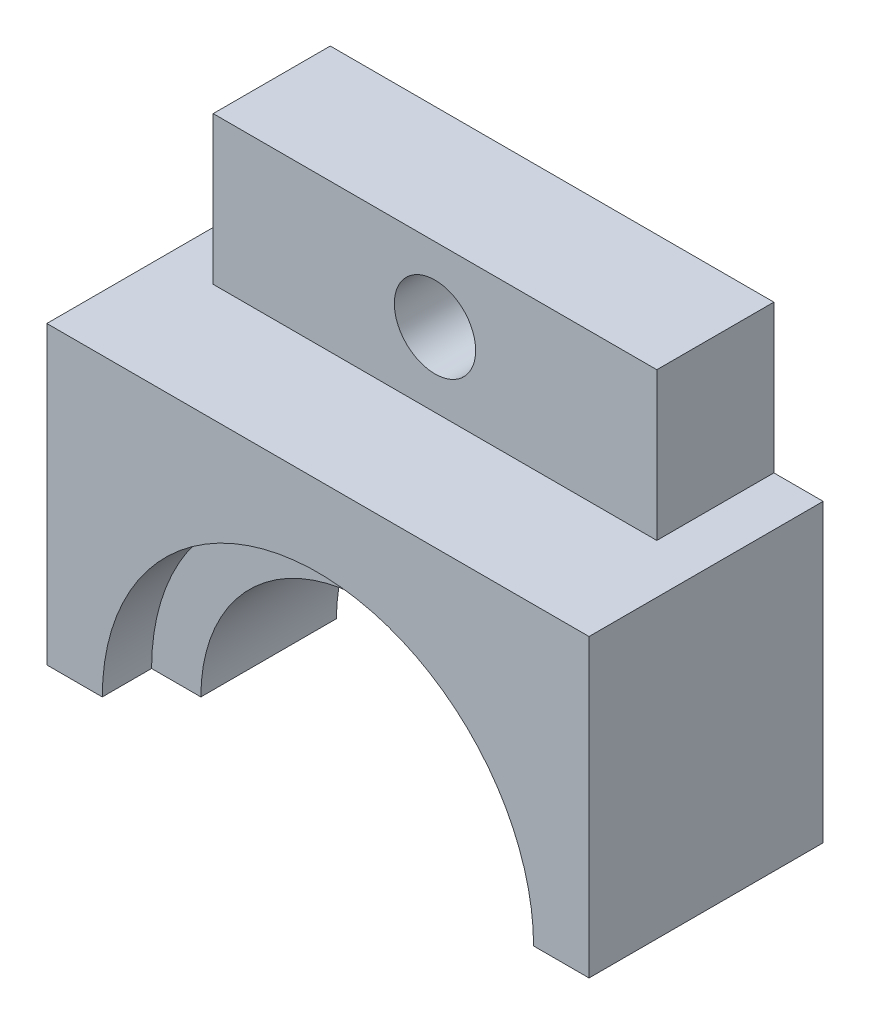
ISO-10303-21;
HEADER;
FILE_DESCRIPTION(('STEP AP214'),'2;1');
FILE_NAME('part.step','',(''),(''),'','','');
FILE_SCHEMA(('AUTOMOTIVE_DESIGN { 1 0 10303 214 1 1 1 1 }'));
ENDSEC;
DATA;
#1=APPLICATION_CONTEXT('core data for automotive mechanical design processes');
#2=APPLICATION_PROTOCOL_DEFINITION('international standard','automotive_design',2000,#1);
#3=PRODUCT_CONTEXT('',#1,'mechanical');
#4=PRODUCT('Part','Part','',(#3));
#5=PRODUCT_RELATED_PRODUCT_CATEGORY('part','',(#4));
#6=PRODUCT_DEFINITION_FORMATION('','',#4);
#7=PRODUCT_DEFINITION_CONTEXT('part definition',#1,'design');
#8=PRODUCT_DEFINITION('design','',#6,#7);
#9=PRODUCT_DEFINITION_SHAPE('','',#8);
#10=(LENGTH_UNIT() NAMED_UNIT(*) SI_UNIT(.MILLI.,.METRE.));
#11=(NAMED_UNIT(*) PLANE_ANGLE_UNIT() SI_UNIT($,.RADIAN.));
#12=(NAMED_UNIT(*) SI_UNIT($,.STERADIAN.) SOLID_ANGLE_UNIT());
#13=UNCERTAINTY_MEASURE_WITH_UNIT(LENGTH_MEASURE(1.E-05),#10,'distance_accuracy_value','');
#14=(GEOMETRIC_REPRESENTATION_CONTEXT(3) GLOBAL_UNCERTAINTY_ASSIGNED_CONTEXT((#13)) GLOBAL_UNIT_ASSIGNED_CONTEXT((#10,
#11,#12)) REPRESENTATION_CONTEXT('',''));
#15=CARTESIAN_POINT('',(0.,0.,0.));
#16=DIRECTION('',(0.,0.,1.));
#17=DIRECTION('',(1.,0.,0.));
#18=AXIS2_PLACEMENT_3D('',#15,#16,#17);
#19=CARTESIAN_POINT('',(0.,12.,9.5));
#20=DIRECTION('',(0.,1.,0.));
#21=DIRECTION('',(0.,0.,1.));
#22=AXIS2_PLACEMENT_3D('',#19,#20,#21);
#23=PLANE('',#22);
#24=DIRECTION('',(0.,0.,1.));
#25=VECTOR('',#24,1.);
#26=CARTESIAN_POINT('',(-9.,12.,1.53584084695265));
#27=LINE('',#26,#25);
#28=CARTESIAN_POINT('',(-9.,12.,0.));
#29=VERTEX_POINT('',#28);
#30=CARTESIAN_POINT('',(-9.,12.,4.75));
#31=VERTEX_POINT('',#30);
#32=EDGE_CURVE('E304',#29,#31,#27,.T.);
#33=ORIENTED_EDGE('',*,*,#32,.F.);
#34=DIRECTION('',(1.,0.,0.));
#35=VECTOR('',#34,1.);
#36=CARTESIAN_POINT('',(0.,12.,0.));
#37=LINE('',#36,#35);
#38=CARTESIAN_POINT('',(-11.,12.,0.));
#39=VERTEX_POINT('',#38);
#40=EDGE_CURVE('E178',#39,#29,#37,.T.);
#41=ORIENTED_EDGE('',*,*,#40,.F.);
#42=DIRECTION('',(0.,0.,-1.));
#43=VECTOR('',#42,1.);
#44=CARTESIAN_POINT('',(-11.,12.,9.5));
#45=LINE('',#44,#43);
#46=CARTESIAN_POINT('',(-11.,12.,9.5));
#47=VERTEX_POINT('',#46);
#48=EDGE_CURVE('E190',#47,#39,#45,.T.);
#49=ORIENTED_EDGE('',*,*,#48,.F.);
#50=DIRECTION('',(1.,0.,0.));
#51=VECTOR('',#50,1.);
#52=CARTESIAN_POINT('',(0.,12.,9.5));
#53=LINE('',#52,#51);
#54=CARTESIAN_POINT('',(11.,12.,9.5));
#55=VERTEX_POINT('',#54);
#56=EDGE_CURVE('E165',#47,#55,#53,.T.);
#57=ORIENTED_EDGE('',*,*,#56,.T.);
#58=DIRECTION('',(0.,0.,-1.));
#59=VECTOR('',#58,1.);
#60=CARTESIAN_POINT('',(11.,12.,9.5));
#61=LINE('',#60,#59);
#62=CARTESIAN_POINT('',(11.,12.,0.));
#63=VERTEX_POINT('',#62);
#64=EDGE_CURVE('E177',#55,#63,#61,.T.);
#65=ORIENTED_EDGE('',*,*,#64,.T.);
#66=CARTESIAN_POINT('',(9.,12.,0.));
#67=VERTEX_POINT('',#66);
#68=EDGE_CURVE('E162',#67,#63,#37,.T.);
#69=ORIENTED_EDGE('',*,*,#68,.F.);
#70=DIRECTION('',(0.,0.,1.));
#71=VECTOR('',#70,1.);
#72=CARTESIAN_POINT('',(9.,12.,1.53584084695265));
#73=LINE('',#72,#71);
#74=CARTESIAN_POINT('',(9.,12.,4.75));
#75=VERTEX_POINT('',#74);
#76=EDGE_CURVE('E320',#67,#75,#73,.T.);
#77=ORIENTED_EDGE('',*,*,#76,.T.);
#78=DIRECTION('',(-1.,0.,0.));
#79=VECTOR('',#78,1.);
#80=CARTESIAN_POINT('',(-1.49993845165652,12.,4.75));
#81=LINE('',#80,#79);
#82=EDGE_CURVE('E39',#75,#31,#81,.T.);
#83=ORIENTED_EDGE('',*,*,#82,.T.);
#84=EDGE_LOOP('',(#33,#41,#49,#57,#65,#69,#77,#83));
#85=FACE_BOUND('',#84,.T.);
#86=ADVANCED_FACE('F16',(#85),#23,.T.);
#87=CARTESIAN_POINT('',(0.,0.,7.5));
#88=DIRECTION('',(0.,0.,-1.));
#89=DIRECTION('',(-1.,0.,0.));
#90=AXIS2_PLACEMENT_3D('',#87,#88,#89);
#91=CYLINDRICAL_SURFACE('',#90,6.75);
#92=CARTESIAN_POINT('',(0.,0.,2.));
#93=DIRECTION('',(0.,0.,-1.));
#94=DIRECTION('',(-1.,0.,0.));
#95=AXIS2_PLACEMENT_3D('',#92,#93,#94);
#96=CIRCLE('',#95,6.75);
#97=CARTESIAN_POINT('',(-6.75,0.,2.));
#98=VERTEX_POINT('',#97);
#99=CARTESIAN_POINT('',(6.75,0.,2.));
#100=VERTEX_POINT('',#99);
#101=EDGE_CURVE('E154',#98,#100,#96,.T.);
#102=ORIENTED_EDGE('',*,*,#101,.T.);
#103=DIRECTION('',(0.,0.,-1.));
#104=VECTOR('',#103,1.);
#105=CARTESIAN_POINT('',(6.75,0.,7.5));
#106=LINE('',#105,#104);
#107=CARTESIAN_POINT('',(6.75,0.,7.5));
#108=VERTEX_POINT('',#107);
#109=EDGE_CURVE('E200',#100,#108,#106,.F.);
#110=ORIENTED_EDGE('',*,*,#109,.T.);
#111=CARTESIAN_POINT('',(0.,0.,7.5));
#112=DIRECTION('',(0.,0.,-1.));
#113=DIRECTION('',(1.,0.,0.));
#114=AXIS2_PLACEMENT_3D('',#111,#112,#113);
#115=CIRCLE('',#114,6.75);
#116=CARTESIAN_POINT('',(-6.75,0.,7.5));
#117=VERTEX_POINT('',#116);
#118=EDGE_CURVE('E121',#117,#108,#115,.T.);
#119=ORIENTED_EDGE('',*,*,#118,.F.);
#120=DIRECTION('',(0.,0.,-1.));
#121=VECTOR('',#120,1.);
#122=CARTESIAN_POINT('',(-6.75,0.,7.5));
#123=LINE('',#122,#121);
#124=EDGE_CURVE('E194',#117,#98,#123,.T.);
#125=ORIENTED_EDGE('',*,*,#124,.T.);
#126=EDGE_LOOP('',(#102,#110,#119,#125));
#127=FACE_BOUND('',#126,.T.);
#128=ADVANCED_FACE('F223',(#127),#91,.F.);
#129=CARTESIAN_POINT('',(0.,0.,7.5));
#130=DIRECTION('',(0.,0.,1.));
#131=DIRECTION('',(1.,0.,0.));
#132=AXIS2_PLACEMENT_3D('',#129,#130,#131);
#133=PLANE('',#132);
#134=DIRECTION('',(-1.,0.,0.));
#135=VECTOR('',#134,1.);
#136=CARTESIAN_POINT('',(0.,0.,7.5));
#137=LINE('',#136,#135);
#138=CARTESIAN_POINT('',(8.75,0.,7.5));
#139=VERTEX_POINT('',#138);
#140=EDGE_CURVE('E97',#139,#108,#137,.T.);
#141=ORIENTED_EDGE('',*,*,#140,.F.);
#142=CARTESIAN_POINT('',(0.,0.,7.5));
#143=DIRECTION('',(0.,0.,1.));
#144=DIRECTION('',(1.,0.,0.));
#145=AXIS2_PLACEMENT_3D('',#142,#143,#144);
#146=CIRCLE('',#145,8.75);
#147=CARTESIAN_POINT('',(-8.75,0.,7.5));
#148=VERTEX_POINT('',#147);
#149=EDGE_CURVE('E108',#139,#148,#146,.T.);
#150=ORIENTED_EDGE('',*,*,#149,.T.);
#151=EDGE_CURVE('E124',#117,#148,#137,.T.);
#152=ORIENTED_EDGE('',*,*,#151,.F.);
#153=ORIENTED_EDGE('',*,*,#118,.T.);
#154=EDGE_LOOP('',(#141,#150,#152,#153));
#155=FACE_BOUND('',#154,.T.);
#156=ADVANCED_FACE('F119',(#155),#133,.T.);
#157=CARTESIAN_POINT('',(0.,0.,7.5));
#158=DIRECTION('',(0.,0.,1.));
#159=DIRECTION('',(1.,0.,0.));
#160=AXIS2_PLACEMENT_3D('',#157,#158,#159);
#161=CYLINDRICAL_SURFACE('',#160,8.75);
#162=CARTESIAN_POINT('',(0.,0.,9.5));
#163=DIRECTION('',(0.,0.,1.));
#164=DIRECTION('',(1.,0.,0.));
#165=AXIS2_PLACEMENT_3D('',#162,#163,#164);
#166=CIRCLE('',#165,8.75);
#167=CARTESIAN_POINT('',(8.75,0.,9.5));
#168=VERTEX_POINT('',#167);
#169=CARTESIAN_POINT('',(-8.75,0.,9.5));
#170=VERTEX_POINT('',#169);
#171=EDGE_CURVE('E117',#168,#170,#166,.T.);
#172=ORIENTED_EDGE('',*,*,#171,.T.);
#173=DIRECTION('',(0.,0.,1.));
#174=VECTOR('',#173,1.);
#175=CARTESIAN_POINT('',(-8.75,0.,7.5));
#176=LINE('',#175,#174);
#177=EDGE_CURVE('E112',#170,#148,#176,.F.);
#178=ORIENTED_EDGE('',*,*,#177,.T.);
#179=ORIENTED_EDGE('',*,*,#149,.F.);
#180=DIRECTION('',(0.,0.,1.));
#181=VECTOR('',#180,1.);
#182=CARTESIAN_POINT('',(8.75,0.,7.5));
#183=LINE('',#182,#181);
#184=EDGE_CURVE('E92',#139,#168,#183,.T.);
#185=ORIENTED_EDGE('',*,*,#184,.T.);
#186=EDGE_LOOP('',(#172,#178,#179,#185));
#187=FACE_BOUND('',#186,.T.);
#188=ADVANCED_FACE('F109',(#187),#161,.F.);
#189=CARTESIAN_POINT('',(0.,0.,2.));
#190=DIRECTION('',(0.,0.,-1.));
#191=DIRECTION('',(1.,0.,0.));
#192=AXIS2_PLACEMENT_3D('',#189,#190,#191);
#193=PLANE('',#192);
#194=DIRECTION('',(1.,0.,0.));
#195=VECTOR('',#194,1.);
#196=CARTESIAN_POINT('',(0.,0.,2.));
#197=LINE('',#196,#195);
#198=CARTESIAN_POINT('',(-8.75,0.,2.));
#199=VERTEX_POINT('',#198);
#200=EDGE_CURVE('E27',#199,#98,#197,.T.);
#201=ORIENTED_EDGE('',*,*,#200,.F.);
#202=CARTESIAN_POINT('',(0.,0.,2.));
#203=DIRECTION('',(0.,0.,-1.));
#204=DIRECTION('',(1.,0.,0.));
#205=AXIS2_PLACEMENT_3D('',#202,#203,#204);
#206=CIRCLE('',#205,8.75);
#207=CARTESIAN_POINT('',(8.75,0.,2.));
#208=VERTEX_POINT('',#207);
#209=EDGE_CURVE('E158',#199,#208,#206,.T.);
#210=ORIENTED_EDGE('',*,*,#209,.T.);
#211=EDGE_CURVE('E10',#100,#208,#197,.T.);
#212=ORIENTED_EDGE('',*,*,#211,.F.);
#213=ORIENTED_EDGE('',*,*,#101,.F.);
#214=EDGE_LOOP('',(#201,#210,#212,#213));
#215=FACE_BOUND('',#214,.T.);
#216=ADVANCED_FACE('F222',(#215),#193,.T.);
#217=CARTESIAN_POINT('',(0.,0.,2.));
#218=DIRECTION('',(0.,0.,-1.));
#219=DIRECTION('',(-1.,0.,0.));
#220=AXIS2_PLACEMENT_3D('',#217,#218,#219);
#221=CYLINDRICAL_SURFACE('',#220,8.75);
#222=CARTESIAN_POINT('',(0.,0.,0.));
#223=DIRECTION('',(0.,0.,-1.));
#224=DIRECTION('',(1.,0.,0.));
#225=AXIS2_PLACEMENT_3D('',#222,#223,#224);
#226=CIRCLE('',#225,8.75);
#227=CARTESIAN_POINT('',(-8.75,0.,0.));
#228=VERTEX_POINT('',#227);
#229=CARTESIAN_POINT('',(8.75,0.,0.));
#230=VERTEX_POINT('',#229);
#231=EDGE_CURVE('E116',#228,#230,#226,.T.);
#232=ORIENTED_EDGE('',*,*,#231,.T.);
#233=DIRECTION('',(0.,0.,-1.));
#234=VECTOR('',#233,1.);
#235=CARTESIAN_POINT('',(8.75,0.,2.));
#236=LINE('',#235,#234);
#237=EDGE_CURVE('E25',#230,#208,#236,.F.);
#238=ORIENTED_EDGE('',*,*,#237,.T.);
#239=ORIENTED_EDGE('',*,*,#209,.F.);
#240=DIRECTION('',(0.,0.,-1.));
#241=VECTOR('',#240,1.);
#242=CARTESIAN_POINT('',(-8.75,0.,2.));
#243=LINE('',#242,#241);
#244=EDGE_CURVE('E137',#199,#228,#243,.T.);
#245=ORIENTED_EDGE('',*,*,#244,.T.);
#246=EDGE_LOOP('',(#232,#238,#239,#245));
#247=FACE_BOUND('',#246,.T.);
#248=ADVANCED_FACE('F369',(#247),#221,.F.);
#249=CARTESIAN_POINT('',(0.,0.,0.));
#250=DIRECTION('',(0.,0.,1.));
#251=DIRECTION('',(1.,0.,0.));
#252=AXIS2_PLACEMENT_3D('',#249,#250,#251);
#253=PLANE('',#252);
#254=CARTESIAN_POINT('',(0.,15.,0.));
#255=DIRECTION('',(0.,0.,1.));
#256=DIRECTION('',(1.,0.,0.));
#257=AXIS2_PLACEMENT_3D('',#254,#255,#256);
#258=CIRCLE('',#257,1.65);
#259=CARTESIAN_POINT('',(1.65,15.,0.));
#260=VERTEX_POINT('',#259);
#261=EDGE_CURVE('E19',#260,#260,#258,.T.);
#262=ORIENTED_EDGE('',*,*,#261,.T.);
#263=EDGE_LOOP('',(#262));
#264=FACE_BOUND('',#263,.T.);
#265=DIRECTION('',(0.,-1.,0.));
#266=VECTOR('',#265,1.);
#267=CARTESIAN_POINT('',(11.,12.2735552060856,0.));
#268=LINE('',#267,#266);
#269=CARTESIAN_POINT('',(11.,0.,0.));
#270=VERTEX_POINT('',#269);
#271=EDGE_CURVE('E170',#63,#270,#268,.T.);
#272=ORIENTED_EDGE('',*,*,#271,.T.);
#273=DIRECTION('',(-1.,0.,0.));
#274=VECTOR('',#273,1.);
#275=CARTESIAN_POINT('',(0.,0.,0.));
#276=LINE('',#275,#274);
#277=EDGE_CURVE('E75',#270,#230,#276,.T.);
#278=ORIENTED_EDGE('',*,*,#277,.T.);
#279=ORIENTED_EDGE('',*,*,#231,.F.);
#280=CARTESIAN_POINT('',(-11.,0.,0.));
#281=VERTEX_POINT('',#280);
#282=EDGE_CURVE('E141',#228,#281,#276,.T.);
#283=ORIENTED_EDGE('',*,*,#282,.T.);
#284=DIRECTION('',(0.,-1.,0.));
#285=VECTOR('',#284,1.);
#286=CARTESIAN_POINT('',(-11.,12.2735552060856,0.));
#287=LINE('',#286,#285);
#288=EDGE_CURVE('E182',#39,#281,#287,.T.);
#289=ORIENTED_EDGE('',*,*,#288,.F.);
#290=ORIENTED_EDGE('',*,*,#40,.T.);
#291=DIRECTION('',(0.,-1.,0.));
#292=VECTOR('',#291,1.);
#293=CARTESIAN_POINT('',(-9.,18.,0.));
#294=LINE('',#293,#292);
#295=CARTESIAN_POINT('',(-9.,18.,0.));
#296=VERTEX_POINT('',#295);
#297=EDGE_CURVE('E327',#296,#29,#294,.T.);
#298=ORIENTED_EDGE('',*,*,#297,.F.);
#299=DIRECTION('',(1.,0.,0.));
#300=VECTOR('',#299,1.);
#301=CARTESIAN_POINT('',(0.,18.,0.));
#302=LINE('',#301,#300);
#303=CARTESIAN_POINT('',(9.,18.,0.));
#304=VERTEX_POINT('',#303);
#305=EDGE_CURVE('E308',#296,#304,#302,.T.);
#306=ORIENTED_EDGE('',*,*,#305,.T.);
#307=DIRECTION('',(0.,-1.,0.));
#308=VECTOR('',#307,1.);
#309=CARTESIAN_POINT('',(9.,18.,0.));
#310=LINE('',#309,#308);
#311=EDGE_CURVE('E293',#304,#67,#310,.T.);
#312=ORIENTED_EDGE('',*,*,#311,.T.);
#313=ORIENTED_EDGE('',*,*,#68,.T.);
#314=EDGE_LOOP('',(#272,#278,#279,#283,#289,#290,#298,#306,#312,#313));
#315=FACE_BOUND('',#314,.T.);
#316=ADVANCED_FACE('F332',(#264,#315),#253,.F.);
#317=CARTESIAN_POINT('',(0.,0.,9.5));
#318=DIRECTION('',(0.,0.,1.));
#319=DIRECTION('',(1.,0.,0.));
#320=AXIS2_PLACEMENT_3D('',#317,#318,#319);
#321=PLANE('',#320);
#322=DIRECTION('',(-1.,0.,0.));
#323=VECTOR('',#322,1.);
#324=CARTESIAN_POINT('',(0.,0.,9.5));
#325=LINE('',#324,#323);
#326=CARTESIAN_POINT('',(11.,0.,9.5));
#327=VERTEX_POINT('',#326);
#328=EDGE_CURVE('E100',#327,#168,#325,.T.);
#329=ORIENTED_EDGE('',*,*,#328,.F.);
#330=DIRECTION('',(0.,-1.,0.));
#331=VECTOR('',#330,1.);
#332=CARTESIAN_POINT('',(11.,12.2735552060856,9.5));
#333=LINE('',#332,#331);
#334=EDGE_CURVE('E174',#55,#327,#333,.T.);
#335=ORIENTED_EDGE('',*,*,#334,.F.);
#336=ORIENTED_EDGE('',*,*,#56,.F.);
#337=DIRECTION('',(0.,-1.,0.));
#338=VECTOR('',#337,1.);
#339=CARTESIAN_POINT('',(-11.,12.2735552060856,9.5));
#340=LINE('',#339,#338);
#341=CARTESIAN_POINT('',(-11.,0.,9.5));
#342=VERTEX_POINT('',#341);
#343=EDGE_CURVE('E169',#47,#342,#340,.T.);
#344=ORIENTED_EDGE('',*,*,#343,.T.);
#345=EDGE_CURVE('E135',#170,#342,#325,.T.);
#346=ORIENTED_EDGE('',*,*,#345,.F.);
#347=ORIENTED_EDGE('',*,*,#171,.F.);
#348=EDGE_LOOP('',(#329,#335,#336,#344,#346,#347));
#349=FACE_BOUND('',#348,.T.);
#350=ADVANCED_FACE('F368',(#349),#321,.T.);
#351=CARTESIAN_POINT('',(11.,12.2735552060856,9.5));
#352=DIRECTION('',(1.,0.,0.));
#353=DIRECTION('',(0.,1.,0.));
#354=AXIS2_PLACEMENT_3D('',#351,#352,#353);
#355=PLANE('',#354);
#356=DIRECTION('',(0.,0.,1.));
#357=VECTOR('',#356,1.);
#358=CARTESIAN_POINT('',(11.,0.,9.5));
#359=LINE('',#358,#357);
#360=EDGE_CURVE('E66',#270,#327,#359,.T.);
#361=ORIENTED_EDGE('',*,*,#360,.F.);
#362=ORIENTED_EDGE('',*,*,#271,.F.);
#363=ORIENTED_EDGE('',*,*,#64,.F.);
#364=ORIENTED_EDGE('',*,*,#334,.T.);
#365=EDGE_LOOP('',(#361,#362,#363,#364));
#366=FACE_BOUND('',#365,.T.);
#367=ADVANCED_FACE('F386',(#366),#355,.T.);
#368=CARTESIAN_POINT('',(-11.,12.2735552060856,9.5));
#369=DIRECTION('',(1.,0.,0.));
#370=DIRECTION('',(0.,1.,0.));
#371=AXIS2_PLACEMENT_3D('',#368,#369,#370);
#372=PLANE('',#371);
#373=ORIENTED_EDGE('',*,*,#288,.T.);
#374=DIRECTION('',(0.,0.,1.));
#375=VECTOR('',#374,1.);
#376=CARTESIAN_POINT('',(-11.,0.,9.5));
#377=LINE('',#376,#375);
#378=EDGE_CURVE('E146',#281,#342,#377,.T.);
#379=ORIENTED_EDGE('',*,*,#378,.T.);
#380=ORIENTED_EDGE('',*,*,#343,.F.);
#381=ORIENTED_EDGE('',*,*,#48,.T.);
#382=EDGE_LOOP('',(#373,#379,#380,#381));
#383=FACE_BOUND('',#382,.T.);
#384=ADVANCED_FACE('F395',(#383),#372,.F.);
#385=CARTESIAN_POINT('',(0.,0.,4.75));
#386=DIRECTION('',(0.,1.,0.));
#387=DIRECTION('',(-1.,0.,0.));
#388=AXIS2_PLACEMENT_3D('',#385,#386,#387);
#389=PLANE('',#388);
#390=ORIENTED_EDGE('',*,*,#282,.F.);
#391=ORIENTED_EDGE('',*,*,#244,.F.);
#392=ORIENTED_EDGE('',*,*,#200,.T.);
#393=ORIENTED_EDGE('',*,*,#124,.F.);
#394=ORIENTED_EDGE('',*,*,#151,.T.);
#395=ORIENTED_EDGE('',*,*,#177,.F.);
#396=ORIENTED_EDGE('',*,*,#345,.T.);
#397=ORIENTED_EDGE('',*,*,#378,.F.);
#398=EDGE_LOOP('',(#390,#391,#392,#393,#394,#395,#396,#397));
#399=FACE_BOUND('',#398,.T.);
#400=ADVANCED_FACE('F214',(#399),#389,.F.);
#401=ORIENTED_EDGE('',*,*,#360,.T.);
#402=ORIENTED_EDGE('',*,*,#328,.T.);
#403=ORIENTED_EDGE('',*,*,#184,.F.);
#404=ORIENTED_EDGE('',*,*,#140,.T.);
#405=ORIENTED_EDGE('',*,*,#109,.F.);
#406=ORIENTED_EDGE('',*,*,#211,.T.);
#407=ORIENTED_EDGE('',*,*,#237,.F.);
#408=ORIENTED_EDGE('',*,*,#277,.F.);
#409=EDGE_LOOP('',(#401,#402,#403,#404,#405,#406,#407,#408));
#410=FACE_BOUND('',#409,.T.);
#411=ADVANCED_FACE('F94',(#410),#389,.F.);
#412=CARTESIAN_POINT('',(-1.49993845165652,18.,4.75));
#413=DIRECTION('',(0.,0.,1.));
#414=DIRECTION('',(1.,0.,0.));
#415=AXIS2_PLACEMENT_3D('',#412,#413,#414);
#416=PLANE('',#415);
#417=CARTESIAN_POINT('',(0.,15.,4.75));
#418=DIRECTION('',(0.,0.,1.));
#419=DIRECTION('',(1.,0.,0.));
#420=AXIS2_PLACEMENT_3D('',#417,#418,#419);
#421=CIRCLE('',#420,1.65);
#422=CARTESIAN_POINT('',(1.65,15.,4.75));
#423=VERTEX_POINT('',#422);
#424=EDGE_CURVE('E344',#423,#423,#421,.T.);
#425=ORIENTED_EDGE('',*,*,#424,.F.);
#426=EDGE_LOOP('',(#425));
#427=FACE_BOUND('',#426,.T.);
#428=ORIENTED_EDGE('',*,*,#82,.F.);
#429=DIRECTION('',(0.,-1.,0.));
#430=VECTOR('',#429,1.);
#431=CARTESIAN_POINT('',(9.,18.,4.75));
#432=LINE('',#431,#430);
#433=CARTESIAN_POINT('',(9.,18.,4.75));
#434=VERTEX_POINT('',#433);
#435=EDGE_CURVE('E132',#434,#75,#432,.T.);
#436=ORIENTED_EDGE('',*,*,#435,.F.);
#437=DIRECTION('',(-1.,0.,0.));
#438=VECTOR('',#437,1.);
#439=CARTESIAN_POINT('',(-1.49993845165652,18.,4.75));
#440=LINE('',#439,#438);
#441=CARTESIAN_POINT('',(-9.,18.,4.75));
#442=VERTEX_POINT('',#441);
#443=EDGE_CURVE('E287',#434,#442,#440,.T.);
#444=ORIENTED_EDGE('',*,*,#443,.T.);
#445=DIRECTION('',(0.,-1.,0.));
#446=VECTOR('',#445,1.);
#447=CARTESIAN_POINT('',(-9.,18.,4.75));
#448=LINE('',#447,#446);
#449=EDGE_CURVE('E317',#442,#31,#448,.T.);
#450=ORIENTED_EDGE('',*,*,#449,.T.);
#451=EDGE_LOOP('',(#428,#436,#444,#450));
#452=FACE_BOUND('',#451,.T.);
#453=ADVANCED_FACE('F286',(#427,#452),#416,.T.);
#454=CARTESIAN_POINT('',(9.,18.,1.53584084695265));
#455=DIRECTION('',(1.,0.,0.));
#456=DIRECTION('',(0.,0.,-1.));
#457=AXIS2_PLACEMENT_3D('',#454,#455,#456);
#458=PLANE('',#457);
#459=ORIENTED_EDGE('',*,*,#76,.F.);
#460=ORIENTED_EDGE('',*,*,#311,.F.);
#461=DIRECTION('',(0.,0.,1.));
#462=VECTOR('',#461,1.);
#463=CARTESIAN_POINT('',(9.,18.,1.53584084695265));
#464=LINE('',#463,#462);
#465=EDGE_CURVE('E298',#304,#434,#464,.T.);
#466=ORIENTED_EDGE('',*,*,#465,.T.);
#467=ORIENTED_EDGE('',*,*,#435,.T.);
#468=EDGE_LOOP('',(#459,#460,#466,#467));
#469=FACE_BOUND('',#468,.T.);
#470=ADVANCED_FACE('F306',(#469),#458,.T.);
#471=CARTESIAN_POINT('',(-9.,18.,1.53584084695265));
#472=DIRECTION('',(1.,0.,0.));
#473=DIRECTION('',(0.,0.,-1.));
#474=AXIS2_PLACEMENT_3D('',#471,#472,#473);
#475=PLANE('',#474);
#476=ORIENTED_EDGE('',*,*,#32,.T.);
#477=ORIENTED_EDGE('',*,*,#449,.F.);
#478=DIRECTION('',(0.,0.,1.));
#479=VECTOR('',#478,1.);
#480=CARTESIAN_POINT('',(-9.,18.,1.53584084695265));
#481=LINE('',#480,#479);
#482=EDGE_CURVE('E301',#296,#442,#481,.T.);
#483=ORIENTED_EDGE('',*,*,#482,.F.);
#484=ORIENTED_EDGE('',*,*,#297,.T.);
#485=EDGE_LOOP('',(#476,#477,#483,#484));
#486=FACE_BOUND('',#485,.T.);
#487=ADVANCED_FACE('F440',(#486),#475,.F.);
#488=CARTESIAN_POINT('',(0.,18.,4.75));
#489=DIRECTION('',(0.,1.,0.));
#490=DIRECTION('',(-1.,0.,0.));
#491=AXIS2_PLACEMENT_3D('',#488,#489,#490);
#492=PLANE('',#491);
#493=ORIENTED_EDGE('',*,*,#443,.F.);
#494=ORIENTED_EDGE('',*,*,#465,.F.);
#495=ORIENTED_EDGE('',*,*,#305,.F.);
#496=ORIENTED_EDGE('',*,*,#482,.T.);
#497=EDGE_LOOP('',(#493,#494,#495,#496));
#498=FACE_BOUND('',#497,.T.);
#499=ADVANCED_FACE('F296',(#498),#492,.T.);
#500=CARTESIAN_POINT('',(0.,15.,-38.5063871323375));
#501=DIRECTION('',(0.,0.,1.));
#502=DIRECTION('',(1.,0.,0.));
#503=AXIS2_PLACEMENT_3D('',#500,#501,#502);
#504=CYLINDRICAL_SURFACE('',#503,1.65);
#505=ORIENTED_EDGE('',*,*,#424,.T.);
#506=EDGE_LOOP('',(#505));
#507=FACE_BOUND('',#506,.T.);
#508=ORIENTED_EDGE('',*,*,#261,.F.);
#509=EDGE_LOOP('',(#508));
#510=FACE_BOUND('',#509,.T.);
#511=ADVANCED_FACE('F348',(#507,#510),#504,.F.);
#512=CLOSED_SHELL('',(#86,#128,#156,#188,#216,#248,#316,#350,#367,#384,#400,#411,#453,#470,#487,
#499,#511));
#513=MANIFOLD_SOLID_BREP('B1',#512);
#514=ADVANCED_BREP_SHAPE_REPRESENTATION('',(#18,#513),#14);
#515=SHAPE_DEFINITION_REPRESENTATION(#9,#514);
ENDSEC;
END-ISO-10303-21;
